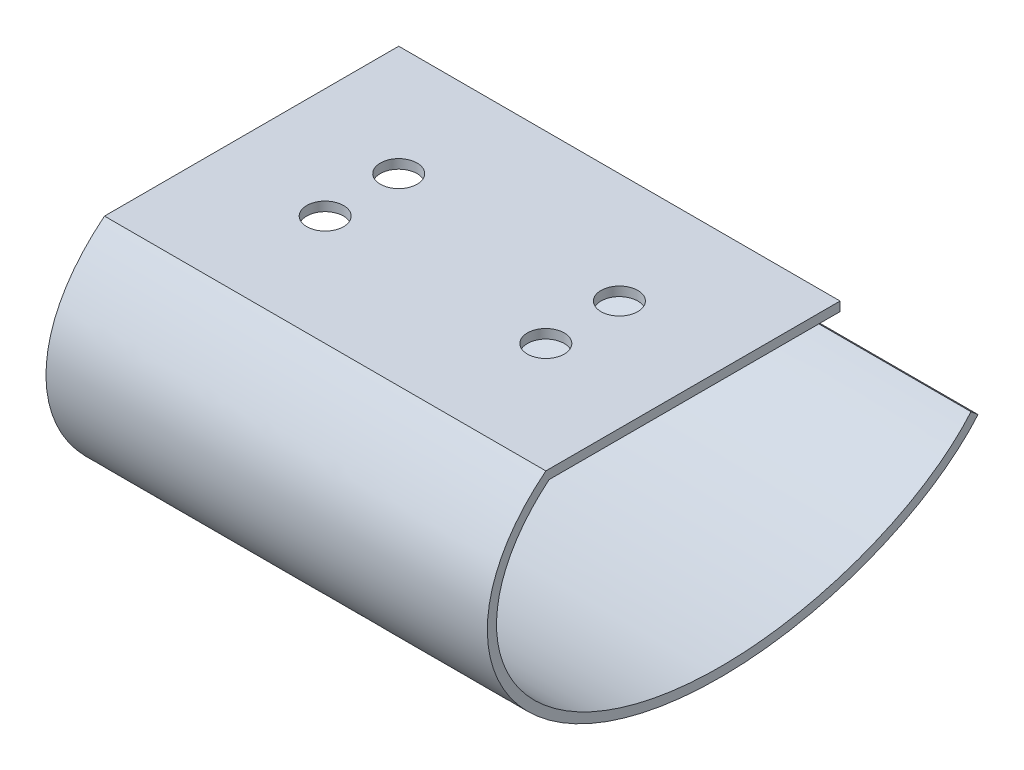
ISO-10303-21;
HEADER;
FILE_DESCRIPTION(('STEP AP214'),'2;1');
FILE_NAME('part.step','',(''),(''),'','','');
FILE_SCHEMA(('AUTOMOTIVE_DESIGN { 1 0 10303 214 1 1 1 1 }'));
ENDSEC;
DATA;
#1=APPLICATION_CONTEXT('core data for automotive mechanical design processes');
#2=APPLICATION_PROTOCOL_DEFINITION('international standard','automotive_design',2000,#1);
#3=PRODUCT_CONTEXT('',#1,'mechanical');
#4=PRODUCT('Part','Part','',(#3));
#5=PRODUCT_RELATED_PRODUCT_CATEGORY('part','',(#4));
#6=PRODUCT_DEFINITION_FORMATION('','',#4);
#7=PRODUCT_DEFINITION_CONTEXT('part definition',#1,'design');
#8=PRODUCT_DEFINITION('design','',#6,#7);
#9=PRODUCT_DEFINITION_SHAPE('','',#8);
#10=(LENGTH_UNIT() NAMED_UNIT(*) SI_UNIT(.MILLI.,.METRE.));
#11=(NAMED_UNIT(*) PLANE_ANGLE_UNIT() SI_UNIT($,.RADIAN.));
#12=(NAMED_UNIT(*) SI_UNIT($,.STERADIAN.) SOLID_ANGLE_UNIT());
#13=UNCERTAINTY_MEASURE_WITH_UNIT(LENGTH_MEASURE(1.E-05),#10,'distance_accuracy_value','');
#14=(GEOMETRIC_REPRESENTATION_CONTEXT(3) GLOBAL_UNCERTAINTY_ASSIGNED_CONTEXT((#13)) GLOBAL_UNIT_ASSIGNED_CONTEXT((#10,
#11,#12)) REPRESENTATION_CONTEXT('',''));
#15=CARTESIAN_POINT('',(0.,0.,0.));
#16=DIRECTION('',(0.,0.,1.));
#17=DIRECTION('',(1.,0.,0.));
#18=AXIS2_PLACEMENT_3D('',#15,#16,#17);
#19=CARTESIAN_POINT('',(76.2,0.,0.));
#20=CARTESIAN_POINT('',(76.2,-18.4552608935604,23.0938686847022));
#21=CARTESIAN_POINT('',(76.2,-47.0977425785151,10.1595441999294));
#22=CARTESIAN_POINT('',(76.2,-55.8258948184616,-21.4733319511247));
#23=CARTESIAN_POINT('',(76.2,-45.9825421496163,-60.1296858104874));
#24=CARTESIAN_POINT('',(76.2,-28.8772196232898,-74.6122246769882));
#25=B_SPLINE_CURVE_WITH_KNOTS('',5,(#19,#20,#21,#22,#23,#24),.UNSPECIFIED.,.F.,.F.,(6,6),(0.,
1.),.UNSPECIFIED.);
#26=DIRECTION('',(-1.,0.,0.));
#27=VECTOR('',#26,1.);
#28=SURFACE_OF_LINEAR_EXTRUSION('',#25,#27);
#29=CARTESIAN_POINT('',(0.,0.,0.));
#30=CARTESIAN_POINT('',(0.,-18.4552608935604,23.0938686847022));
#31=CARTESIAN_POINT('',(0.,-47.0977425785151,10.1595441999294));
#32=CARTESIAN_POINT('',(0.,-55.8258948184616,-21.4733319511247));
#33=CARTESIAN_POINT('',(0.,-45.9825421496163,-60.1296858104874));
#34=CARTESIAN_POINT('',(0.,-28.8772196232898,-74.6122246769882));
#35=B_SPLINE_CURVE_WITH_KNOTS('',5,(#29,#30,#31,#32,#33,#34),.UNSPECIFIED.,.F.,.F.,(6,6),(0.,
1.),.UNSPECIFIED.);
#36=CARTESIAN_POINT('',(0.,0.,0.));
#37=VERTEX_POINT('',#36);
#38=CARTESIAN_POINT('',(0.,-28.8772196232898,-74.6122246769882));
#39=VERTEX_POINT('',#38);
#40=EDGE_CURVE('E121',#37,#39,#35,.T.);
#41=ORIENTED_EDGE('',*,*,#40,.T.);
#42=DIRECTION('',(-1.,0.,0.));
#43=VECTOR('',#42,1.);
#44=CARTESIAN_POINT('',(76.2,-28.8772196232898,-74.6122246769882));
#45=LINE('',#44,#43);
#46=CARTESIAN_POINT('',(76.2,-28.8772196232898,-74.6122246769882));
#47=VERTEX_POINT('',#46);
#48=EDGE_CURVE('E11',#47,#39,#45,.T.);
#49=ORIENTED_EDGE('',*,*,#48,.F.);
#50=CARTESIAN_POINT('',(76.2,0.,0.));
#51=VERTEX_POINT('',#50);
#52=EDGE_CURVE('E142',#51,#47,#25,.T.);
#53=ORIENTED_EDGE('',*,*,#52,.F.);
#54=DIRECTION('',(-1.,0.,0.));
#55=VECTOR('',#54,1.);
#56=CARTESIAN_POINT('',(76.2,0.,0.));
#57=LINE('',#56,#55);
#58=EDGE_CURVE('E117',#51,#37,#57,.T.);
#59=ORIENTED_EDGE('',*,*,#58,.T.);
#60=EDGE_LOOP('',(#41,#49,#53,#59));
#61=FACE_BOUND('',#60,.T.);
#62=ADVANCED_FACE('F36',(#61),#28,.F.);
#63=CARTESIAN_POINT('',(76.2,-27.8514229433483,-73.4006565107587));
#64=DIRECTION('',(0.,-0.763192545656428,0.646171136971051));
#65=DIRECTION('',(0.,-0.646171136971051,-0.763192545656428));
#66=AXIS2_PLACEMENT_3D('',#63,#64,#65);
#67=PLANE('',#66);
#68=DIRECTION('',(0.,0.646171136971051,0.763192545656428));
#69=VECTOR('',#68,1.);
#70=CARTESIAN_POINT('',(0.,-27.8514229433483,-73.4006565107587));
#71=LINE('',#70,#69);
#72=CARTESIAN_POINT('',(0.,-27.8514229433483,-73.4006565107587));
#73=VERTEX_POINT('',#72);
#74=EDGE_CURVE('E126',#39,#73,#71,.T.);
#75=ORIENTED_EDGE('',*,*,#74,.T.);
#76=DIRECTION('',(-1.,0.,0.));
#77=VECTOR('',#76,1.);
#78=CARTESIAN_POINT('',(76.2,-27.8514229433483,-73.4006565107587));
#79=LINE('',#78,#77);
#80=CARTESIAN_POINT('',(76.2,-27.8514229433483,-73.4006565107587));
#81=VERTEX_POINT('',#80);
#82=EDGE_CURVE('E45',#81,#73,#79,.T.);
#83=ORIENTED_EDGE('',*,*,#82,.F.);
#84=DIRECTION('',(0.,0.646171136971051,0.763192545656428));
#85=VECTOR('',#84,1.);
#86=CARTESIAN_POINT('',(76.2,-27.8514229433483,-73.4006565107587));
#87=LINE('',#86,#85);
#88=EDGE_CURVE('E90',#47,#81,#87,.T.);
#89=ORIENTED_EDGE('',*,*,#88,.F.);
#90=ORIENTED_EDGE('',*,*,#48,.T.);
#91=EDGE_LOOP('',(#75,#83,#89,#90));
#92=FACE_BOUND('',#91,.T.);
#93=ADVANCED_FACE('F171',(#92),#67,.F.);
#94=CARTESIAN_POINT('',(76.2,-27.8514229433483,-73.4006565107587));
#95=CARTESIAN_POINT('',(76.2,-28.2764390656422,-73.0408087206607));
#96=CARTESIAN_POINT('',(76.2,-29.093361117157,-72.3030303462169));
#97=CARTESIAN_POINT('',(76.2,-30.7160194970168,-70.6562618696872));
#98=CARTESIAN_POINT('',(76.2,-32.6551623638066,-68.3424344213553));
#99=CARTESIAN_POINT('',(76.2,-34.8297682495697,-65.1946895386385));
#100=CARTESIAN_POINT('',(76.2,-37.4881017480894,-60.5780878134316));
#101=CARTESIAN_POINT('',(76.2,-40.3094533715194,-54.146349457135));
#102=CARTESIAN_POINT('',(76.2,-42.7606443166839,-45.7574647224322));
#103=CARTESIAN_POINT('',(76.2,-44.1842361803423,-37.0536190612094));
#104=CARTESIAN_POINT('',(76.2,-44.6359857443104,-25.4673718297125));
#105=CARTESIAN_POINT('',(76.2,-42.4084605119202,-11.7963686900782));
#106=CARTESIAN_POINT('',(76.2,-36.6587949624379,-1.07022457602721));
#107=CARTESIAN_POINT('',(76.2,-30.43388116905,4.80233178735822));
#108=CARTESIAN_POINT('',(76.2,-25.1390054859876,7.66422175145831));
#109=CARTESIAN_POINT('',(76.2,-19.4035135148367,8.81652012487906));
#110=CARTESIAN_POINT('',(76.2,-14.4018468217834,8.20490067068065));
#111=CARTESIAN_POINT('',(76.2,-10.3662468760613,6.64691989580979));
#112=CARTESIAN_POINT('',(76.2,-7.35860103534012,4.90785963328545));
#113=CARTESIAN_POINT('',(76.2,-4.89539246606144,2.94304911933865));
#114=CARTESIAN_POINT('',(76.2,-2.98878792554125,1.05912119063901));
#115=CARTESIAN_POINT('',(76.2,-2.03727665114656,-0.019090287220052));
#116=CARTESIAN_POINT('',(76.2,-1.58750000000072,-0.563538481801055));
#117=B_SPLINE_CURVE_WITH_KNOTS('',3,(#94,#95,#96,#97,#98,#99,#100,#101,#102,#103,#104,#105,#106,
#107,#108,#109,#110,#111,#112,#113,#114,#115,#116),.UNSPECIFIED.,.F.,.F.,(4,1,1,1,1,1,1,1,1,1,1,
1,1,1,1,1,1,1,1,1,4),(0.00392370139734743,0.0194873935630139,0.0350510857286803,
0.0661784700600132,0.0973058543913461,0.128433238722679,0.190688007385345,0.252942776048011,
0.315197544710676,0.377452313373342,0.501961850698674,0.626471388024005,0.688726156686671,
0.750980925349337,0.813235694012003,0.875490462674668,0.906617847006001,0.937745231337334,
0.968872615668667,0.984436307834334,1.),.UNSPECIFIED.);
#118=DIRECTION('',(-1.,0.,0.));
#119=VECTOR('',#118,1.);
#120=SURFACE_OF_LINEAR_EXTRUSION('',#117,#119);
#121=CARTESIAN_POINT('',(0.,-27.8514229433483,-73.4006565107587));
#122=CARTESIAN_POINT('',(0.,-28.2764390656422,-73.0408087206607));
#123=CARTESIAN_POINT('',(0.,-29.093361117157,-72.3030303462169));
#124=CARTESIAN_POINT('',(0.,-30.7160194970168,-70.6562618696872));
#125=CARTESIAN_POINT('',(0.,-32.6551623638066,-68.3424344213553));
#126=CARTESIAN_POINT('',(0.,-34.8297682495697,-65.1946895386385));
#127=CARTESIAN_POINT('',(0.,-37.4881017480894,-60.5780878134316));
#128=CARTESIAN_POINT('',(0.,-40.3094533715194,-54.146349457135));
#129=CARTESIAN_POINT('',(0.,-42.7606443166839,-45.7574647224322));
#130=CARTESIAN_POINT('',(0.,-44.1842361803423,-37.0536190612094));
#131=CARTESIAN_POINT('',(0.,-44.6359857443104,-25.4673718297125));
#132=CARTESIAN_POINT('',(0.,-42.4084605119202,-11.7963686900782));
#133=CARTESIAN_POINT('',(0.,-36.6587949624379,-1.07022457602721));
#134=CARTESIAN_POINT('',(0.,-30.43388116905,4.80233178735822));
#135=CARTESIAN_POINT('',(0.,-25.1390054859876,7.66422175145831));
#136=CARTESIAN_POINT('',(0.,-19.4035135148367,8.81652012487906));
#137=CARTESIAN_POINT('',(0.,-14.4018468217834,8.20490067068065));
#138=CARTESIAN_POINT('',(0.,-10.3662468760613,6.64691989580979));
#139=CARTESIAN_POINT('',(0.,-7.35860103534012,4.90785963328545));
#140=CARTESIAN_POINT('',(0.,-4.89539246606144,2.94304911933865));
#141=CARTESIAN_POINT('',(0.,-2.98878792554125,1.05912119063901));
#142=CARTESIAN_POINT('',(0.,-2.03727665114656,-0.019090287220052));
#143=CARTESIAN_POINT('',(0.,-1.58750000000072,-0.563538481801055));
#144=B_SPLINE_CURVE_WITH_KNOTS('',3,(#121,#122,#123,#124,#125,#126,#127,#128,#129,#130,#131,
#132,#133,#134,#135,#136,#137,#138,#139,#140,#141,#142,#143),.UNSPECIFIED.,.F.,.F.,(4,1,1,1,1,1,
1,1,1,1,1,1,1,1,1,1,1,1,1,1,4),(0.00392370139734743,0.0194873935630139,0.0350510857286803,
0.0661784700600132,0.0973058543913461,0.128433238722679,0.190688007385345,0.252942776048011,
0.315197544710676,0.377452313373342,0.501961850698674,0.626471388024005,0.688726156686671,
0.750980925349337,0.813235694012003,0.875490462674668,0.906617847006001,0.937745231337334,
0.968872615668667,0.984436307834334,1.),.UNSPECIFIED.);
#145=CARTESIAN_POINT('',(0.,-1.58750000000072,-0.563538481801055));
#146=VERTEX_POINT('',#145);
#147=EDGE_CURVE('E132',#73,#146,#144,.T.);
#148=ORIENTED_EDGE('',*,*,#147,.T.);
#149=DIRECTION('',(-1.,0.,0.));
#150=VECTOR('',#149,1.);
#151=CARTESIAN_POINT('',(76.2,-1.58750000000072,-0.563538481801055));
#152=LINE('',#151,#150);
#153=CARTESIAN_POINT('',(76.2,-1.58750000000072,-0.563538481801055));
#154=VERTEX_POINT('',#153);
#155=EDGE_CURVE('E112',#154,#146,#152,.T.);
#156=ORIENTED_EDGE('',*,*,#155,.F.);
#157=EDGE_CURVE('E103',#81,#154,#117,.T.);
#158=ORIENTED_EDGE('',*,*,#157,.F.);
#159=ORIENTED_EDGE('',*,*,#82,.T.);
#160=EDGE_LOOP('',(#148,#156,#158,#159));
#161=FACE_BOUND('',#160,.T.);
#162=ADVANCED_FACE('F148',(#161),#120,.F.);
#163=CARTESIAN_POINT('',(76.2,-1.58750000000072,-0.563538481801055));
#164=DIRECTION('',(0.,1.,0.));
#165=DIRECTION('',(0.,0.,1.));
#166=AXIS2_PLACEMENT_3D('',#163,#164,#165);
#167=PLANE('',#166);
#168=CARTESIAN_POINT('',(57.15,-1.58750000000045,-19.05));
#169=DIRECTION('',(0.,1.,0.));
#170=DIRECTION('',(0.,0.,1.));
#171=AXIS2_PLACEMENT_3D('',#168,#169,#170);
#172=CIRCLE('',#171,3.175);
#173=CARTESIAN_POINT('',(57.15,-1.5875000000005,-15.875));
#174=VERTEX_POINT('',#173);
#175=EDGE_CURVE('E127',#174,#174,#172,.T.);
#176=ORIENTED_EDGE('',*,*,#175,.T.);
#177=EDGE_LOOP('',(#176));
#178=FACE_BOUND('',#177,.T.);
#179=CARTESIAN_POINT('',(19.05,-1.58750000000027,-31.75));
#180=DIRECTION('',(0.,1.,0.));
#181=DIRECTION('',(0.,0.,1.));
#182=AXIS2_PLACEMENT_3D('',#179,#180,#181);
#183=CIRCLE('',#182,3.175);
#184=CARTESIAN_POINT('',(19.05,-1.58750000000032,-28.575));
#185=VERTEX_POINT('',#184);
#186=EDGE_CURVE('E196',#185,#185,#183,.T.);
#187=ORIENTED_EDGE('',*,*,#186,.T.);
#188=EDGE_LOOP('',(#187));
#189=FACE_BOUND('',#188,.T.);
#190=CARTESIAN_POINT('',(19.05,-1.58750000000045,-19.05));
#191=DIRECTION('',(0.,1.,0.));
#192=DIRECTION('',(0.,0.,1.));
#193=AXIS2_PLACEMENT_3D('',#190,#191,#192);
#194=CIRCLE('',#193,3.175);
#195=CARTESIAN_POINT('',(19.05,-1.5875000000005,-15.875));
#196=VERTEX_POINT('',#195);
#197=EDGE_CURVE('E199',#196,#196,#194,.T.);
#198=ORIENTED_EDGE('',*,*,#197,.T.);
#199=EDGE_LOOP('',(#198));
#200=FACE_BOUND('',#199,.T.);
#201=CARTESIAN_POINT('',(57.15,-1.58750000000027,-31.75));
#202=DIRECTION('',(0.,1.,0.));
#203=DIRECTION('',(0.,0.,1.));
#204=AXIS2_PLACEMENT_3D('',#201,#202,#203);
#205=CIRCLE('',#204,3.175);
#206=CARTESIAN_POINT('',(57.15,-1.58750000000032,-28.575));
#207=VERTEX_POINT('',#206);
#208=EDGE_CURVE('E202',#207,#207,#205,.T.);
#209=ORIENTED_EDGE('',*,*,#208,.T.);
#210=EDGE_LOOP('',(#209));
#211=FACE_BOUND('',#210,.T.);
#212=DIRECTION('',(0.,0.,-1.));
#213=VECTOR('',#212,1.);
#214=CARTESIAN_POINT('',(0.,-1.58750000000072,-0.563538481801055));
#215=LINE('',#214,#213);
#216=CARTESIAN_POINT('',(0.,-1.5875,-50.8));
#217=VERTEX_POINT('',#216);
#218=EDGE_CURVE('E111',#146,#217,#215,.T.);
#219=ORIENTED_EDGE('',*,*,#218,.T.);
#220=DIRECTION('',(-1.,0.,0.));
#221=VECTOR('',#220,1.);
#222=CARTESIAN_POINT('',(76.2,-1.5875,-50.8));
#223=LINE('',#222,#221);
#224=CARTESIAN_POINT('',(76.2,-1.5875,-50.8));
#225=VERTEX_POINT('',#224);
#226=EDGE_CURVE('E108',#225,#217,#223,.T.);
#227=ORIENTED_EDGE('',*,*,#226,.F.);
#228=DIRECTION('',(0.,0.,-1.));
#229=VECTOR('',#228,1.);
#230=CARTESIAN_POINT('',(76.2,-1.58750000000072,-0.563538481801055));
#231=LINE('',#230,#229);
#232=EDGE_CURVE('E97',#154,#225,#231,.T.);
#233=ORIENTED_EDGE('',*,*,#232,.F.);
#234=ORIENTED_EDGE('',*,*,#155,.T.);
#235=EDGE_LOOP('',(#219,#227,#233,#234));
#236=FACE_BOUND('',#235,.T.);
#237=ADVANCED_FACE('F109',(#178,#189,#200,#211,#236),#167,.F.);
#238=CARTESIAN_POINT('',(76.2,0.,-50.8));
#239=DIRECTION('',(0.,0.,1.));
#240=DIRECTION('',(1.,0.,0.));
#241=AXIS2_PLACEMENT_3D('',#238,#239,#240);
#242=PLANE('',#241);
#243=DIRECTION('',(0.,1.,0.));
#244=VECTOR('',#243,1.);
#245=CARTESIAN_POINT('',(0.,0.,-50.8));
#246=LINE('',#245,#244);
#247=CARTESIAN_POINT('',(0.,0.,-50.8));
#248=VERTEX_POINT('',#247);
#249=EDGE_CURVE('E76',#217,#248,#246,.T.);
#250=ORIENTED_EDGE('',*,*,#249,.T.);
#251=DIRECTION('',(-1.,0.,0.));
#252=VECTOR('',#251,1.);
#253=CARTESIAN_POINT('',(76.2,0.,-50.8));
#254=LINE('',#253,#252);
#255=CARTESIAN_POINT('',(76.2,0.,-50.8));
#256=VERTEX_POINT('',#255);
#257=EDGE_CURVE('E113',#256,#248,#254,.T.);
#258=ORIENTED_EDGE('',*,*,#257,.F.);
#259=DIRECTION('',(0.,1.,0.));
#260=VECTOR('',#259,1.);
#261=CARTESIAN_POINT('',(76.2,0.,-50.8));
#262=LINE('',#261,#260);
#263=EDGE_CURVE('E101',#225,#256,#262,.T.);
#264=ORIENTED_EDGE('',*,*,#263,.F.);
#265=ORIENTED_EDGE('',*,*,#226,.T.);
#266=EDGE_LOOP('',(#250,#258,#264,#265));
#267=FACE_BOUND('',#266,.T.);
#268=ADVANCED_FACE('F115',(#267),#242,.F.);
#269=CARTESIAN_POINT('',(76.2,0.,0.));
#270=DIRECTION('',(0.,-1.,0.));
#271=DIRECTION('',(0.,0.,-1.));
#272=AXIS2_PLACEMENT_3D('',#269,#270,#271);
#273=PLANE('',#272);
#274=CARTESIAN_POINT('',(57.15,0.,-19.05));
#275=DIRECTION('',(0.,1.,0.));
#276=DIRECTION('',(0.,0.,1.));
#277=AXIS2_PLACEMENT_3D('',#274,#275,#276);
#278=CIRCLE('',#277,3.175);
#279=CARTESIAN_POINT('',(57.15,0.,-15.875));
#280=VERTEX_POINT('',#279);
#281=EDGE_CURVE('E208',#280,#280,#278,.T.);
#282=ORIENTED_EDGE('',*,*,#281,.F.);
#283=EDGE_LOOP('',(#282));
#284=FACE_BOUND('',#283,.T.);
#285=CARTESIAN_POINT('',(19.05,0.,-31.75));
#286=DIRECTION('',(0.,1.,0.));
#287=DIRECTION('',(0.,0.,1.));
#288=AXIS2_PLACEMENT_3D('',#285,#286,#287);
#289=CIRCLE('',#288,3.175);
#290=CARTESIAN_POINT('',(19.05,0.,-28.575));
#291=VERTEX_POINT('',#290);
#292=EDGE_CURVE('E209',#291,#291,#289,.T.);
#293=ORIENTED_EDGE('',*,*,#292,.F.);
#294=EDGE_LOOP('',(#293));
#295=FACE_BOUND('',#294,.T.);
#296=CARTESIAN_POINT('',(19.05,0.,-19.05));
#297=DIRECTION('',(0.,1.,0.));
#298=DIRECTION('',(0.,0.,1.));
#299=AXIS2_PLACEMENT_3D('',#296,#297,#298);
#300=CIRCLE('',#299,3.175);
#301=CARTESIAN_POINT('',(19.05,0.,-15.875));
#302=VERTEX_POINT('',#301);
#303=EDGE_CURVE('E212',#302,#302,#300,.T.);
#304=ORIENTED_EDGE('',*,*,#303,.F.);
#305=EDGE_LOOP('',(#304));
#306=FACE_BOUND('',#305,.T.);
#307=CARTESIAN_POINT('',(57.15,0.,-31.75));
#308=DIRECTION('',(0.,1.,0.));
#309=DIRECTION('',(0.,0.,1.));
#310=AXIS2_PLACEMENT_3D('',#307,#308,#309);
#311=CIRCLE('',#310,3.175);
#312=CARTESIAN_POINT('',(57.15,0.,-28.575));
#313=VERTEX_POINT('',#312);
#314=EDGE_CURVE('E205',#313,#313,#311,.T.);
#315=ORIENTED_EDGE('',*,*,#314,.F.);
#316=EDGE_LOOP('',(#315));
#317=FACE_BOUND('',#316,.T.);
#318=DIRECTION('',(0.,0.,1.));
#319=VECTOR('',#318,1.);
#320=CARTESIAN_POINT('',(0.,0.,0.));
#321=LINE('',#320,#319);
#322=EDGE_CURVE('E82',#248,#37,#321,.T.);
#323=ORIENTED_EDGE('',*,*,#322,.T.);
#324=ORIENTED_EDGE('',*,*,#58,.F.);
#325=DIRECTION('',(0.,0.,1.));
#326=VECTOR('',#325,1.);
#327=CARTESIAN_POINT('',(76.2,0.,0.));
#328=LINE('',#327,#326);
#329=EDGE_CURVE('E53',#256,#51,#328,.T.);
#330=ORIENTED_EDGE('',*,*,#329,.F.);
#331=ORIENTED_EDGE('',*,*,#257,.T.);
#332=EDGE_LOOP('',(#323,#324,#330,#331));
#333=FACE_BOUND('',#332,.T.);
#334=ADVANCED_FACE('F155',(#284,#295,#306,#317,#333),#273,.F.);
#335=CARTESIAN_POINT('',(76.2,-43.1344565252794,-11.6540371193083));
#336=DIRECTION('',(-1.,0.,0.));
#337=DIRECTION('',(0.,0.,1.));
#338=AXIS2_PLACEMENT_3D('',#335,#336,#337);
#339=PLANE('',#338);
#340=ORIENTED_EDGE('',*,*,#52,.T.);
#341=ORIENTED_EDGE('',*,*,#88,.T.);
#342=ORIENTED_EDGE('',*,*,#157,.T.);
#343=ORIENTED_EDGE('',*,*,#232,.T.);
#344=ORIENTED_EDGE('',*,*,#263,.T.);
#345=ORIENTED_EDGE('',*,*,#329,.T.);
#346=EDGE_LOOP('',(#340,#341,#342,#343,#344,#345));
#347=FACE_BOUND('',#346,.T.);
#348=ADVANCED_FACE('F99',(#347),#339,.F.);
#349=CARTESIAN_POINT('',(0.,-43.1344565252794,-11.6540371193083));
#350=DIRECTION('',(-1.,0.,0.));
#351=DIRECTION('',(0.,0.,1.));
#352=AXIS2_PLACEMENT_3D('',#349,#350,#351);
#353=PLANE('',#352);
#354=ORIENTED_EDGE('',*,*,#40,.F.);
#355=ORIENTED_EDGE('',*,*,#322,.F.);
#356=ORIENTED_EDGE('',*,*,#249,.F.);
#357=ORIENTED_EDGE('',*,*,#218,.F.);
#358=ORIENTED_EDGE('',*,*,#147,.F.);
#359=ORIENTED_EDGE('',*,*,#74,.F.);
#360=EDGE_LOOP('',(#354,#355,#356,#357,#358,#359));
#361=FACE_BOUND('',#360,.T.);
#362=ADVANCED_FACE('F151',(#361),#353,.T.);
#363=CARTESIAN_POINT('',(57.15,-25.4,-31.75));
#364=DIRECTION('',(0.,1.,0.));
#365=DIRECTION('',(0.,0.,1.));
#366=AXIS2_PLACEMENT_3D('',#363,#364,#365);
#367=CYLINDRICAL_SURFACE('',#366,3.175);
#368=ORIENTED_EDGE('',*,*,#314,.T.);
#369=EDGE_LOOP('',(#368));
#370=FACE_BOUND('',#369,.T.);
#371=ORIENTED_EDGE('',*,*,#208,.F.);
#372=EDGE_LOOP('',(#371));
#373=FACE_BOUND('',#372,.T.);
#374=ADVANCED_FACE('F224',(#370,#373),#367,.F.);
#375=CARTESIAN_POINT('',(19.05,-25.4,-19.05));
#376=DIRECTION('',(0.,1.,0.));
#377=DIRECTION('',(0.,0.,1.));
#378=AXIS2_PLACEMENT_3D('',#375,#376,#377);
#379=CYLINDRICAL_SURFACE('',#378,3.175);
#380=ORIENTED_EDGE('',*,*,#303,.T.);
#381=EDGE_LOOP('',(#380));
#382=FACE_BOUND('',#381,.T.);
#383=ORIENTED_EDGE('',*,*,#197,.F.);
#384=EDGE_LOOP('',(#383));
#385=FACE_BOUND('',#384,.T.);
#386=ADVANCED_FACE('F218',(#382,#385),#379,.F.);
#387=CARTESIAN_POINT('',(19.05,-25.4,-31.75));
#388=DIRECTION('',(0.,1.,0.));
#389=DIRECTION('',(0.,0.,1.));
#390=AXIS2_PLACEMENT_3D('',#387,#388,#389);
#391=CYLINDRICAL_SURFACE('',#390,3.175);
#392=ORIENTED_EDGE('',*,*,#292,.T.);
#393=EDGE_LOOP('',(#392));
#394=FACE_BOUND('',#393,.T.);
#395=ORIENTED_EDGE('',*,*,#186,.F.);
#396=EDGE_LOOP('',(#395));
#397=FACE_BOUND('',#396,.T.);
#398=ADVANCED_FACE('F240',(#394,#397),#391,.F.);
#399=CARTESIAN_POINT('',(57.15,-25.4,-19.05));
#400=DIRECTION('',(0.,1.,0.));
#401=DIRECTION('',(0.,0.,1.));
#402=AXIS2_PLACEMENT_3D('',#399,#400,#401);
#403=CYLINDRICAL_SURFACE('',#402,3.175);
#404=ORIENTED_EDGE('',*,*,#281,.T.);
#405=EDGE_LOOP('',(#404));
#406=FACE_BOUND('',#405,.T.);
#407=ORIENTED_EDGE('',*,*,#175,.F.);
#408=EDGE_LOOP('',(#407));
#409=FACE_BOUND('',#408,.T.);
#410=ADVANCED_FACE('F245',(#406,#409),#403,.F.);
#411=CLOSED_SHELL('',(#62,#93,#162,#237,#268,#334,#348,#362,#374,#386,#398,#410));
#412=MANIFOLD_SOLID_BREP('B2',#411);
#413=ADVANCED_BREP_SHAPE_REPRESENTATION('',(#18,#412),#14);
#414=SHAPE_DEFINITION_REPRESENTATION(#9,#413);
ENDSEC;
END-ISO-10303-21;
